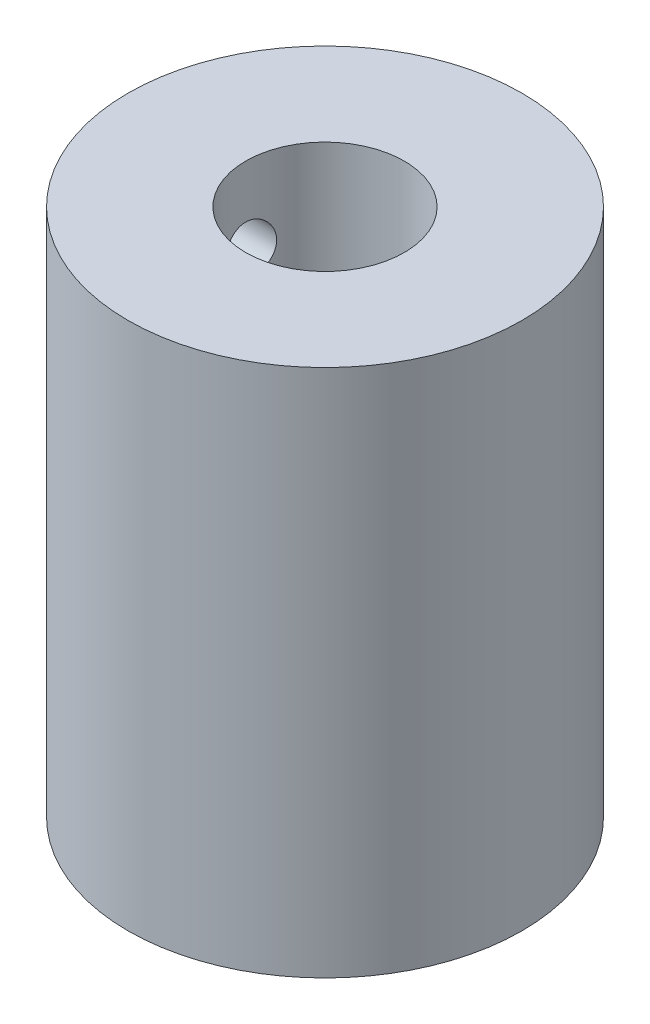
ISO-10303-21;
HEADER;
FILE_DESCRIPTION(('STEP AP214'),'2;1');
FILE_NAME('part.step','',(''),(''),'','','');
FILE_SCHEMA(('AUTOMOTIVE_DESIGN { 1 0 10303 214 1 1 1 1 }'));
ENDSEC;
DATA;
#1=APPLICATION_CONTEXT('core data for automotive mechanical design processes');
#2=APPLICATION_PROTOCOL_DEFINITION('international standard','automotive_design',2000,#1);
#3=PRODUCT_CONTEXT('',#1,'mechanical');
#4=PRODUCT('Part','Part','',(#3));
#5=PRODUCT_RELATED_PRODUCT_CATEGORY('part','',(#4));
#6=PRODUCT_DEFINITION_FORMATION('','',#4);
#7=PRODUCT_DEFINITION_CONTEXT('part definition',#1,'design');
#8=PRODUCT_DEFINITION('design','',#6,#7);
#9=PRODUCT_DEFINITION_SHAPE('','',#8);
#10=(LENGTH_UNIT() NAMED_UNIT(*) SI_UNIT(.MILLI.,.METRE.));
#11=(NAMED_UNIT(*) PLANE_ANGLE_UNIT() SI_UNIT($,.RADIAN.));
#12=(NAMED_UNIT(*) SI_UNIT($,.STERADIAN.) SOLID_ANGLE_UNIT());
#13=UNCERTAINTY_MEASURE_WITH_UNIT(LENGTH_MEASURE(1.E-05),#10,'distance_accuracy_value','');
#14=(GEOMETRIC_REPRESENTATION_CONTEXT(3) GLOBAL_UNCERTAINTY_ASSIGNED_CONTEXT((#13)) GLOBAL_UNIT_ASSIGNED_CONTEXT((#10,
#11,#12)) REPRESENTATION_CONTEXT('',''));
#15=CARTESIAN_POINT('',(0.,0.,0.));
#16=DIRECTION('',(0.,0.,1.));
#17=DIRECTION('',(1.,0.,0.));
#18=AXIS2_PLACEMENT_3D('',#15,#16,#17);
#19=CARTESIAN_POINT('',(0.,20.,0.));
#20=DIRECTION('',(0.,-1.,0.));
#21=DIRECTION('',(0.,0.,-1.));
#22=AXIS2_PLACEMENT_3D('',#19,#20,#21);
#23=CYLINDRICAL_SURFACE('',#22,7.45);
#24=CARTESIAN_POINT('',(1.,3.,-7.38258084954036));
#25=CARTESIAN_POINT('',(0.999997645400204,2.94410169763584,-7.38258170331428));
#26=CARTESIAN_POINT('',(0.99529724235351,2.88816932296943,-7.38322257330105));
#27=CARTESIAN_POINT('',(0.976622141665487,2.77786368377539,-7.38571557292466));
#28=CARTESIAN_POINT('',(0.962637977532072,2.72349206982755,-7.38756893889477));
#29=CARTESIAN_POINT('',(0.925817218650584,2.61792082504263,-7.39227331246216));
#30=CARTESIAN_POINT('',(0.902986905254793,2.56671897331643,-7.39512361203106));
#31=CARTESIAN_POINT('',(0.849135860641029,2.46888182869361,-7.40149984789184));
#32=CARTESIAN_POINT('',(0.818116434203476,2.42224580993907,-7.4050256765264));
#33=CARTESIAN_POINT('',(0.748554162377439,2.33455535543556,-7.41238108854343));
#34=CARTESIAN_POINT('',(0.70996908487496,2.29353455401465,-7.41621230187082));
#35=CARTESIAN_POINT('',(0.626461838407959,2.21852983336225,-7.42373218553235));
#36=CARTESIAN_POINT('',(0.581539343106109,2.18454627672732,-7.42742084851359));
#37=CARTESIAN_POINT('',(0.486419483847112,2.12445875346027,-7.43425684783715));
#38=CARTESIAN_POINT('',(0.436202597172797,2.0983854293843,-7.43740205922315));
#39=CARTESIAN_POINT('',(0.332053448363079,2.05505489150232,-7.44277880827385));
#40=CARTESIAN_POINT('',(0.278121344489348,2.03779730242485,-7.4450103848297));
#41=CARTESIAN_POINT('',(0.168417680763351,2.01268916471027,-7.44829693847962));
#42=CARTESIAN_POINT('',(0.112659170988225,2.00478252969571,-7.44935892800465));
#43=CARTESIAN_POINT('',(0.000597339815735183,1.99842680456468,-7.45021062828972));
#44=CARTESIAN_POINT('',(-0.0557059569452209,1.99997728875477,-7.45000039631629));
#45=CARTESIAN_POINT('',(-0.166877155876536,2.01244708134004,-7.4483369897478));
#46=CARTESIAN_POINT('',(-0.221751961335271,2.02330606355887,-7.44689181868991));
#47=CARTESIAN_POINT('',(-0.328893310994701,2.05399016724789,-7.44292986541744));
#48=CARTESIAN_POINT('',(-0.38115979927786,2.07381548084816,-7.44041306024));
#49=CARTESIAN_POINT('',(-0.481786167261498,2.12193279364412,-7.43457683220193));
#50=CARTESIAN_POINT('',(-0.530133534522473,2.15025065110632,-7.43125496408351));
#51=CARTESIAN_POINT('',(-0.621412782397326,2.21453037883939,-7.42417976807758));
#52=CARTESIAN_POINT('',(-0.66434437665651,2.250492653033,-7.42042641739582));
#53=CARTESIAN_POINT('',(-0.743928247923886,2.32937763276685,-7.41287289085389));
#54=CARTESIAN_POINT('',(-0.780528383536931,2.37235294845326,-7.40907257906374));
#55=CARTESIAN_POINT('',(-0.846004483868647,2.46386406866308,-7.40188251619775));
#56=CARTESIAN_POINT('',(-0.874880417194314,2.5123998957846,-7.39849276679056));
#57=CARTESIAN_POINT('',(-0.924092817199452,2.61370348413235,-7.39250771679622));
#58=CARTESIAN_POINT('',(-0.944424696491131,2.66647350067617,-7.38991284318795));
#59=CARTESIAN_POINT('',(-0.975923448856904,2.77472152376982,-7.38581938930108));
#60=CARTESIAN_POINT('',(-0.987090833972513,2.83019937884292,-7.38432074777396));
#61=CARTESIAN_POINT('',(-0.999873691203416,2.94182657431515,-7.3826007989611));
#62=CARTESIAN_POINT('',(-1.00156272811868,2.99796734453828,-7.38236965450527));
#63=CARTESIAN_POINT('',(-0.99553542929721,3.1097310753776,-7.38318482057278));
#64=CARTESIAN_POINT('',(-0.987819325611321,3.16535404873513,-7.38423109957856));
#65=CARTESIAN_POINT('',(-0.963262877705742,3.27428021059784,-7.3874742269472));
#66=CARTESIAN_POINT('',(-0.94645851261494,3.32759165711244,-7.38966653719971));
#67=CARTESIAN_POINT('',(-0.904239727209987,3.43064051388447,-7.39495101040206));
#68=CARTESIAN_POINT('',(-0.878824960954892,3.4803777804444,-7.39804320950612));
#69=CARTESIAN_POINT('',(-0.819927373465069,3.57519818581024,-7.40480247970032));
#70=CARTESIAN_POINT('',(-0.786396526269947,3.62025124876591,-7.40847292558871));
#71=CARTESIAN_POINT('',(-0.71228608981359,3.70411668208743,-7.4159646832325));
#72=CARTESIAN_POINT('',(-0.671706183397911,3.74292877150522,-7.41978600177005));
#73=CARTESIAN_POINT('',(-0.584327262843444,3.81347095708011,-7.42717934527045));
#74=CARTESIAN_POINT('',(-0.537488930586319,3.84515256841748,-7.43074955634675));
#75=CARTESIAN_POINT('',(-0.439112697014432,3.90019818744169,-7.43721093802309));
#76=CARTESIAN_POINT('',(-0.387574902646891,3.92356238435137,-7.44010212407058));
#77=CARTESIAN_POINT('',(-0.281420416728985,3.96123078553831,-7.44487168523601));
#78=CARTESIAN_POINT('',(-0.22681362410881,3.97556248128878,-7.44675313099575));
#79=CARTESIAN_POINT('',(-0.115941675997092,3.99484833990756,-7.44930402533317));
#80=CARTESIAN_POINT('',(-0.0596766074940375,3.99980299378309,-7.44997353737091));
#81=CARTESIAN_POINT('',(0.0524424419087253,4.00018397090241,-7.45002471277878));
#82=CARTESIAN_POINT('',(0.108296179416053,3.99568485092285,-7.44941645324873));
#83=CARTESIAN_POINT('',(0.218445784939562,3.97744456417632,-7.44700055517507));
#84=CARTESIAN_POINT('',(0.27274165526669,3.96370341111977,-7.44519291841072));
#85=CARTESIAN_POINT('',(0.378220726617245,3.92739361913248,-7.44058042312791));
#86=CARTESIAN_POINT('',(0.429405372349325,3.90482911410382,-7.43777603166324));
#87=CARTESIAN_POINT('',(0.527273569364535,3.85152090866849,-7.43147967949717));
#88=CARTESIAN_POINT('',(0.573957034252993,3.82077705131169,-7.42798770560238));
#89=CARTESIAN_POINT('',(0.661877738152335,3.75170906695792,-7.42067259000544));
#90=CARTESIAN_POINT('',(0.703071304334227,3.71332958550199,-7.41684715189412));
#91=CARTESIAN_POINT('',(0.77846166510691,3.63019565075688,-7.40931418752633));
#92=CARTESIAN_POINT('',(0.812656806728394,3.58543969562212,-7.40560668930051));
#93=CARTESIAN_POINT('',(0.873212613010541,3.49059207480214,-7.39871174636514));
#94=CARTESIAN_POINT('',(0.89953769411989,3.4404775254132,-7.39552669223205));
#95=CARTESIAN_POINT('',(0.943359794130172,3.33652238361955,-7.39006524262075));
#96=CARTESIAN_POINT('',(0.960866262074337,3.28268584994734,-7.38778787511548));
#97=CARTESIAN_POINT('',(0.982438375370373,3.19048578941782,-7.38494335708258));
#98=CARTESIAN_POINT('',(0.989014306737438,3.15269990570701,-7.38406192679017));
#99=CARTESIAN_POINT('',(0.997795905723238,3.07661468096957,-7.38288038311155));
#100=CARTESIAN_POINT('',(1.00000161395426,3.03831534471777,-7.38258026432326));
#101=CARTESIAN_POINT('',(1.,3.,-7.38258084954036));
#102=B_SPLINE_CURVE_WITH_KNOTS('',3,(#24,#25,#26,#27,#28,#29,#30,#31,#32,#33,#34,#35,#36,#37,
#38,#39,#40,#41,#42,#43,#44,#45,#46,#47,#48,#49,#50,#51,#52,#53,#54,#55,#56,#57,#58,#59,#60,#61,
#62,#63,#64,#65,#66,#67,#68,#69,#70,#71,#72,#73,#74,#75,#76,#77,#78,#79,#80,#81,#82,#83,#84,#85,
#86,#87,#88,#89,#90,#91,#92,#93,#94,#95,#96,#97,#98,#99,#100,#101),.UNSPECIFIED.,.T.,.F.,(4,2,2,
2,2,2,2,2,2,2,2,2,2,2,2,2,2,2,2,2,2,2,2,2,2,2,2,2,2,2,2,2,2,2,2,2,2,2,4),(0.,0.167554909925281,
0.335280935682564,0.50288808245323,0.670468540292591,0.839012539812198,1.00756522146231,
1.17676273978665,1.34595305504806,1.51412334720662,1.68228606956924,1.84936713787568,
2.01645178655633,2.18405043415548,2.35165793968893,2.52058606137221,2.68951486960931,
2.85853426188155,3.02754421000582,3.19524057881276,3.36293281016999,3.52996598021867,
3.69700586197165,3.86505944484783,4.03312059082576,4.20229211342098,4.37145978708404,
4.54011006057664,4.70875150284153,4.87606795524449,5.04338415943658,5.21062206666606,
5.37786318318436,5.54636405375193,5.71490467700144,5.88419619603604,6.05330593323288,
6.16815707400658,6.28300714746888),.UNSPECIFIED.);
#103=CARTESIAN_POINT('',(1.,3.,-7.38258084954036));
#104=VERTEX_POINT('',#103);
#105=EDGE_CURVE('E100',#104,#104,#102,.T.);
#106=ORIENTED_EDGE('',*,*,#105,.F.);
#107=EDGE_LOOP('',(#106));
#108=FACE_BOUND('',#107,.T.);
#109=CARTESIAN_POINT('',(-7.38258084954036,17.,-1.));
#110=CARTESIAN_POINT('',(-7.38258170331428,16.9441016976358,-0.999997645400203));
#111=CARTESIAN_POINT('',(-7.38322257330105,16.8881693229694,-0.995297242353509));
#112=CARTESIAN_POINT('',(-7.38571557292466,16.7778636837754,-0.976622141665486));
#113=CARTESIAN_POINT('',(-7.38756893889477,16.7234920698276,-0.962637977532071));
#114=CARTESIAN_POINT('',(-7.39227331246216,16.6179208250426,-0.925817218650584));
#115=CARTESIAN_POINT('',(-7.39512361203106,16.5667189733164,-0.902986905254794));
#116=CARTESIAN_POINT('',(-7.40149984789184,16.4688818286936,-0.849135860641032));
#117=CARTESIAN_POINT('',(-7.4050256765264,16.4222458099391,-0.818116434203478));
#118=CARTESIAN_POINT('',(-7.41238108854343,16.3345553554356,-0.748554162377441));
#119=CARTESIAN_POINT('',(-7.41621230187082,16.2935345540147,-0.709969084874962));
#120=CARTESIAN_POINT('',(-7.42373218553235,16.2185298333623,-0.62646183840796));
#121=CARTESIAN_POINT('',(-7.42742084851359,16.1845462767273,-0.581539343106111));
#122=CARTESIAN_POINT('',(-7.43425684783715,16.1244587534603,-0.486419483847114));
#123=CARTESIAN_POINT('',(-7.43740205922315,16.0983854293843,-0.436202597172799));
#124=CARTESIAN_POINT('',(-7.44277880827385,16.0550548915023,-0.33205344836308));
#125=CARTESIAN_POINT('',(-7.4450103848297,16.0377973024249,-0.278121344489349));
#126=CARTESIAN_POINT('',(-7.44829693847962,16.0126891647103,-0.168417680763352));
#127=CARTESIAN_POINT('',(-7.44935892800465,16.0047825296957,-0.112659170988225));
#128=CARTESIAN_POINT('',(-7.45021062828972,15.9984268045647,-0.000597339815735664));
#129=CARTESIAN_POINT('',(-7.45000039631629,15.9999772887548,0.0557059569452206));
#130=CARTESIAN_POINT('',(-7.4483369897478,16.01244708134,0.166877155876536));
#131=CARTESIAN_POINT('',(-7.44689181868991,16.0233060635589,0.22175196133527));
#132=CARTESIAN_POINT('',(-7.44292986541744,16.0539901672479,0.3288933109947));
#133=CARTESIAN_POINT('',(-7.44041306024,16.0738154808482,0.38115979927786));
#134=CARTESIAN_POINT('',(-7.43457683220193,16.1219327936441,0.481786167261498));
#135=CARTESIAN_POINT('',(-7.43125496408351,16.1502506511063,0.530133534522473));
#136=CARTESIAN_POINT('',(-7.42417976807758,16.2145303788394,0.621412782397326));
#137=CARTESIAN_POINT('',(-7.42042641739582,16.250492653033,0.664344376656511));
#138=CARTESIAN_POINT('',(-7.41287289085389,16.3293776327668,0.743928247923886));
#139=CARTESIAN_POINT('',(-7.40907257906374,16.3723529484533,0.780528383536931));
#140=CARTESIAN_POINT('',(-7.40188251619775,16.4638640686631,0.846004483868648));
#141=CARTESIAN_POINT('',(-7.39849276679055,16.5123998957846,0.874880417194316));
#142=CARTESIAN_POINT('',(-7.39250771679622,16.6137034841323,0.924092817199454));
#143=CARTESIAN_POINT('',(-7.38991284318795,16.6664735006762,0.944424696491133));
#144=CARTESIAN_POINT('',(-7.38581938930108,16.7747215237698,0.975923448856906));
#145=CARTESIAN_POINT('',(-7.38432074777396,16.8301993788429,0.987090833972515));
#146=CARTESIAN_POINT('',(-7.3826007989611,16.9418265743151,0.999873691203418));
#147=CARTESIAN_POINT('',(-7.38236965450527,16.9979673445383,1.00156272811868));
#148=CARTESIAN_POINT('',(-7.38318482057278,17.1097310753776,0.995535429297212));
#149=CARTESIAN_POINT('',(-7.38423109957856,17.1653540487351,0.987819325611323));
#150=CARTESIAN_POINT('',(-7.3874742269472,17.2742802105978,0.963262877705744));
#151=CARTESIAN_POINT('',(-7.38966653719971,17.3275916571124,0.946458512614942));
#152=CARTESIAN_POINT('',(-7.39495101040206,17.4306405138845,0.90423972720999));
#153=CARTESIAN_POINT('',(-7.39804320950611,17.4803777804444,0.878824960954896));
#154=CARTESIAN_POINT('',(-7.40480247970032,17.5751981858102,0.819927373465074));
#155=CARTESIAN_POINT('',(-7.40847292558871,17.6202512487659,0.786396526269952));
#156=CARTESIAN_POINT('',(-7.4159646832325,17.7041166820874,0.712286089813593));
#157=CARTESIAN_POINT('',(-7.41978600177005,17.7429287715052,0.671706183397914));
#158=CARTESIAN_POINT('',(-7.42717934527045,17.8134709570801,0.584327262843445));
#159=CARTESIAN_POINT('',(-7.43074955634675,17.8451525684175,0.537488930586321));
#160=CARTESIAN_POINT('',(-7.43721093802309,17.9001981874417,0.439112697014435));
#161=CARTESIAN_POINT('',(-7.44010212407058,17.9235623843514,0.387574902646894));
#162=CARTESIAN_POINT('',(-7.44487168523601,17.9612307855383,0.281420416728989));
#163=CARTESIAN_POINT('',(-7.44675313099575,17.9755624812888,0.226813624108814));
#164=CARTESIAN_POINT('',(-7.44930402533317,17.9948483399076,0.115941675997096));
#165=CARTESIAN_POINT('',(-7.44997353737091,17.9998029937831,0.0596766074940417));
#166=CARTESIAN_POINT('',(-7.45002471277878,18.0001839709024,-0.0524424419087207));
#167=CARTESIAN_POINT('',(-7.44941645324873,17.9956848509228,-0.108296179416048));
#168=CARTESIAN_POINT('',(-7.44700055517507,17.9774445641763,-0.218445784939557));
#169=CARTESIAN_POINT('',(-7.44519291841072,17.9637034111198,-0.272741655266686));
#170=CARTESIAN_POINT('',(-7.44058042312791,17.9273936191325,-0.378220726617241));
#171=CARTESIAN_POINT('',(-7.43777603166324,17.9048291141038,-0.429405372349321));
#172=CARTESIAN_POINT('',(-7.43147967949717,17.8515209086685,-0.527273569364532));
#173=CARTESIAN_POINT('',(-7.42798770560238,17.8207770513117,-0.573957034252989));
#174=CARTESIAN_POINT('',(-7.42067259000544,17.7517090669579,-0.661877738152331));
#175=CARTESIAN_POINT('',(-7.41684715189412,17.713329585502,-0.703071304334223));
#176=CARTESIAN_POINT('',(-7.40931418752633,17.6301956507569,-0.778461665106906));
#177=CARTESIAN_POINT('',(-7.40560668930052,17.5854396956221,-0.812656806728391));
#178=CARTESIAN_POINT('',(-7.39871174636514,17.4905920748021,-0.873212613010539));
#179=CARTESIAN_POINT('',(-7.39552669223205,17.4404775254132,-0.899537694119888));
#180=CARTESIAN_POINT('',(-7.39006524262075,17.3365223836196,-0.94335979413017));
#181=CARTESIAN_POINT('',(-7.38778787511548,17.2826858499473,-0.960866262074336));
#182=CARTESIAN_POINT('',(-7.38494335708258,17.1904857894178,-0.982438375370372));
#183=CARTESIAN_POINT('',(-7.38406192679017,17.152699905707,-0.989014306737437));
#184=CARTESIAN_POINT('',(-7.38288038311155,17.0766146809696,-0.997795905723237));
#185=CARTESIAN_POINT('',(-7.38258026432326,17.0383153447178,-1.00000161395426));
#186=CARTESIAN_POINT('',(-7.38258084954036,17.,-1.));
#187=B_SPLINE_CURVE_WITH_KNOTS('',3,(#109,#110,#111,#112,#113,#114,#115,#116,#117,#118,#119,
#120,#121,#122,#123,#124,#125,#126,#127,#128,#129,#130,#131,#132,#133,#134,#135,#136,#137,#138,
#139,#140,#141,#142,#143,#144,#145,#146,#147,#148,#149,#150,#151,#152,#153,#154,#155,#156,#157,
#158,#159,#160,#161,#162,#163,#164,#165,#166,#167,#168,#169,#170,#171,#172,#173,#174,#175,#176,
#177,#178,#179,#180,#181,#182,#183,#184,#185,#186),.UNSPECIFIED.,.T.,.F.,(4,2,2,2,2,2,2,2,2,2,2,
2,2,2,2,2,2,2,2,2,2,2,2,2,2,2,2,2,2,2,2,2,2,2,2,2,2,2,4),(0.,0.167554909925278,
0.335280935682562,0.502888082453225,0.670468540292588,0.839012539812195,1.00756522146231,
1.17676273978665,1.34595305504806,1.51412334720662,1.68228606956924,1.84936713787568,
2.01645178655633,2.18405043415547,2.35165793968893,2.52058606137221,2.68951486960931,
2.85853426188155,3.02754421000582,3.19524057881276,3.36293281016999,3.52996598021868,
3.69700586197165,3.86505944484783,4.03312059082576,4.20229211342098,4.37145978708404,
4.54011006057664,4.70875150284153,4.87606795524449,5.04338415943658,5.21062206666606,
5.37786318318437,5.54636405375193,5.71490467700144,5.88419619603604,6.05330593323288,
6.16815707400659,6.28300714746889),.UNSPECIFIED.);
#188=CARTESIAN_POINT('',(-7.38258084954036,17.,-1.));
#189=VERTEX_POINT('',#188);
#190=EDGE_CURVE('E76',#189,#189,#187,.T.);
#191=ORIENTED_EDGE('',*,*,#190,.F.);
#192=EDGE_LOOP('',(#191));
#193=FACE_BOUND('',#192,.T.);
#194=CARTESIAN_POINT('',(0.,20.,0.));
#195=DIRECTION('',(0.,1.,0.));
#196=DIRECTION('',(0.,0.,1.));
#197=AXIS2_PLACEMENT_3D('',#194,#195,#196);
#198=CIRCLE('',#197,7.45);
#199=CARTESIAN_POINT('',(0.,20.,7.45));
#200=VERTEX_POINT('',#199);
#201=EDGE_CURVE('E10',#200,#200,#198,.T.);
#202=ORIENTED_EDGE('',*,*,#201,.F.);
#203=EDGE_LOOP('',(#202));
#204=FACE_BOUND('',#203,.T.);
#205=CARTESIAN_POINT('',(0.,0.,0.));
#206=DIRECTION('',(0.,1.,0.));
#207=DIRECTION('',(0.,0.,1.));
#208=AXIS2_PLACEMENT_3D('',#205,#206,#207);
#209=CIRCLE('',#208,7.45);
#210=CARTESIAN_POINT('',(0.,0.,7.45));
#211=VERTEX_POINT('',#210);
#212=EDGE_CURVE('E56',#211,#211,#209,.T.);
#213=ORIENTED_EDGE('',*,*,#212,.T.);
#214=EDGE_LOOP('',(#213));
#215=FACE_BOUND('',#214,.T.);
#216=ADVANCED_FACE('F43',(#108,#193,#204,#215),#23,.T.);
#217=CARTESIAN_POINT('',(0.,20.,0.));
#218=DIRECTION('',(0.,1.,0.));
#219=DIRECTION('',(0.,0.,1.));
#220=AXIS2_PLACEMENT_3D('',#217,#218,#219);
#221=PLANE('',#220);
#222=CARTESIAN_POINT('',(0.,20.,0.));
#223=DIRECTION('',(0.,1.,0.));
#224=DIRECTION('',(0.,0.,1.));
#225=AXIS2_PLACEMENT_3D('',#222,#223,#224);
#226=CIRCLE('',#225,3.);
#227=CARTESIAN_POINT('',(0.,20.,3.));
#228=VERTEX_POINT('',#227);
#229=EDGE_CURVE('E65',#228,#228,#226,.T.);
#230=ORIENTED_EDGE('',*,*,#229,.F.);
#231=EDGE_LOOP('',(#230));
#232=FACE_BOUND('',#231,.T.);
#233=ORIENTED_EDGE('',*,*,#201,.T.);
#234=EDGE_LOOP('',(#233));
#235=FACE_BOUND('',#234,.T.);
#236=ADVANCED_FACE('F119',(#232,#235),#221,.T.);
#237=CARTESIAN_POINT('',(0.,0.,0.));
#238=DIRECTION('',(0.,1.,0.));
#239=DIRECTION('',(0.,0.,1.));
#240=AXIS2_PLACEMENT_3D('',#237,#238,#239);
#241=PLANE('',#240);
#242=CARTESIAN_POINT('',(0.,0.,0.));
#243=DIRECTION('',(0.,-1.,0.));
#244=DIRECTION('',(0.,0.,-1.));
#245=AXIS2_PLACEMENT_3D('',#242,#243,#244);
#246=CIRCLE('',#245,2.5);
#247=CARTESIAN_POINT('',(0.,0.,-2.5));
#248=VERTEX_POINT('',#247);
#249=EDGE_CURVE('E75',#248,#248,#246,.T.);
#250=ORIENTED_EDGE('',*,*,#249,.F.);
#251=EDGE_LOOP('',(#250));
#252=FACE_BOUND('',#251,.T.);
#253=ORIENTED_EDGE('',*,*,#212,.F.);
#254=EDGE_LOOP('',(#253));
#255=FACE_BOUND('',#254,.T.);
#256=ADVANCED_FACE('F121',(#252,#255),#241,.F.);
#257=CARTESIAN_POINT('',(0.,6.,0.));
#258=DIRECTION('',(0.,1.,0.));
#259=DIRECTION('',(0.,0.,1.));
#260=AXIS2_PLACEMENT_3D('',#257,#258,#259);
#261=CYLINDRICAL_SURFACE('',#260,3.);
#262=CARTESIAN_POINT('',(-2.82842712474619,17.,-1.));
#263=CARTESIAN_POINT('',(-2.82842694532735,16.9455318251893,-1.0000002579478));
#264=CARTESIAN_POINT('',(-2.83001769372806,16.8910652002285,-0.995534783698141));
#265=CARTESIAN_POINT('',(-2.8361757417458,16.7837455790494,-0.977851131702565));
#266=CARTESIAN_POINT('',(-2.8407435316722,16.7308928501361,-0.964631512170674));
#267=CARTESIAN_POINT('',(-2.85228203663888,16.6283731069872,-0.929955485680263));
#268=CARTESIAN_POINT('',(-2.8592480396464,16.5787000705531,-0.908515221402));
#269=CARTESIAN_POINT('',(-2.87479122017008,16.4836399514562,-0.858061628442626));
#270=CARTESIAN_POINT('',(-2.88336875305432,16.4382538174475,-0.829046628860522));
#271=CARTESIAN_POINT('',(-2.90154489405589,16.3512800376605,-0.763051146442526));
#272=CARTESIAN_POINT('',(-2.91116894844139,16.309884571328,-0.725824341377824));
#273=CARTESIAN_POINT('',(-2.93013864801509,16.2337931987757,-0.644987667214489));
#274=CARTESIAN_POINT('',(-2.93948424829099,16.1990983684177,-0.601376775052401));
#275=CARTESIAN_POINT('',(-2.95713866921658,16.1365211026703,-0.507604507964984));
#276=CARTESIAN_POINT('',(-2.96541407701568,16.108840029382,-0.457301911224518));
#277=CARTESIAN_POINT('',(-2.97969586771021,16.0624084148725,-0.35243122298748));
#278=CARTESIAN_POINT('',(-2.98570286203012,16.0436554668231,-0.297864285687213));
#279=CARTESIAN_POINT('',(-2.99459075431897,16.0162641453676,-0.188028817433491));
#280=CARTESIAN_POINT('',(-2.99757314777558,16.007296553743,-0.132850754852966));
#281=CARTESIAN_POINT('',(-3.00043608218249,15.9986837066393,-0.0216978748240898));
#282=CARTESIAN_POINT('',(-3.00031742262891,15.9990360483476,0.034276733543894));
#283=CARTESIAN_POINT('',(-2.99706039618736,16.008844254566,0.143103515193819));
#284=CARTESIAN_POINT('',(-2.99404064755135,16.0179425284745,0.195992048591669));
#285=CARTESIAN_POINT('',(-2.98546967339714,16.0443929809805,0.299443438822162));
#286=CARTESIAN_POINT('',(-2.97991827631115,16.0617457189798,0.350006137779177));
#287=CARTESIAN_POINT('',(-2.96675670293292,16.1044213173061,0.448152474842015));
#288=CARTESIAN_POINT('',(-2.9591204252427,16.1298459385468,0.495688220968999));
#289=CARTESIAN_POINT('',(-2.94258393038665,16.1878597054484,0.585924325527171));
#290=CARTESIAN_POINT('',(-2.93368336200518,16.2204508433266,0.628623334384771));
#291=CARTESIAN_POINT('',(-2.9150619185089,16.2936743934607,0.710100866551908));
#292=CARTESIAN_POINT('',(-2.90532215172667,16.3346131578454,0.748600157067557));
#293=CARTESIAN_POINT('',(-2.88647335245111,16.4224487257227,0.81827725959589));
#294=CARTESIAN_POINT('',(-2.8773644173145,16.4693464457132,0.849453943273005));
#295=CARTESIAN_POINT('',(-2.86070525135531,16.5686536256154,0.903987455042733));
#296=CARTESIAN_POINT('',(-2.85317909338821,16.6211321313678,0.92722646365105));
#297=CARTESIAN_POINT('',(-2.84081650878299,16.7295713942663,0.964443193299508));
#298=CARTESIAN_POINT('',(-2.83597895501223,16.7855306812218,0.97842479575553));
#299=CARTESIAN_POINT('',(-2.8297963630207,16.8966383554006,0.996161282090474));
#300=CARTESIAN_POINT('',(-2.82830360315139,16.9517094247457,1.00034909550575));
#301=CARTESIAN_POINT('',(-2.828566720628,17.061776149117,0.999605438911604));
#302=CARTESIAN_POINT('',(-2.83032200792768,17.1167718160248,0.99467562522726));
#303=CARTESIAN_POINT('',(-2.83673618089379,17.2231569657112,0.976225651551829));
#304=CARTESIAN_POINT('',(-2.84129325440593,17.2746054301506,0.963006393980554));
#305=CARTESIAN_POINT('',(-2.8526855367127,17.3745436062394,0.928713862560595));
#306=CARTESIAN_POINT('',(-2.85952114934907,17.4230327915908,0.907639196363456));
#307=CARTESIAN_POINT('',(-2.87496877595718,17.5173804208469,0.857474340738899));
#308=CARTESIAN_POINT('',(-2.8836302566561,17.5631066426418,0.828151118358485));
#309=CARTESIAN_POINT('',(-2.90165768730984,17.6491460523837,0.762585630557566));
#310=CARTESIAN_POINT('',(-2.911023844438,17.6894576386612,0.726341325498783));
#311=CARTESIAN_POINT('',(-2.92995038637844,17.7655279840906,0.645891705900321));
#312=CARTESIAN_POINT('',(-2.93949843577895,17.8009743900189,0.601387270546649));
#313=CARTESIAN_POINT('',(-2.9572685161311,17.863916142348,0.506827291400255));
#314=CARTESIAN_POINT('',(-2.96549059417695,17.8914117711624,0.45677194486455));
#315=CARTESIAN_POINT('',(-2.97964405810603,17.9374201048617,0.352779862432294));
#316=CARTESIAN_POINT('',(-2.98559030004531,17.9559912771481,0.298871123321195));
#317=CARTESIAN_POINT('',(-2.99458610837774,17.9837277420601,0.188458465846016));
#318=CARTESIAN_POINT('',(-2.99763672034018,17.9928964298805,0.131955491953888));
#319=CARTESIAN_POINT('',(-3.00041863236257,18.0012620776056,0.020815335860039));
#320=CARTESIAN_POINT('',(-3.00029920089441,18.0009074539324,-0.0337847239200205));
#321=CARTESIAN_POINT('',(-2.99712196519396,17.9913426918536,-0.142111145000175));
#322=CARTESIAN_POINT('',(-2.99406439933567,17.9821332718472,-0.195837576819057));
#323=CARTESIAN_POINT('',(-2.98540914954421,17.955417765424,-0.300042119432062));
#324=CARTESIAN_POINT('',(-2.9798525836118,17.9380457846471,-0.350558270912796));
#325=CARTESIAN_POINT('',(-2.96677160704464,17.8956224689029,-0.44797835093979));
#326=CARTESIAN_POINT('',(-2.95924684047901,17.8705697448031,-0.494881624142411));
#327=CARTESIAN_POINT('',(-2.94265868828001,17.8124304878979,-0.58563401630881));
#328=CARTESIAN_POINT('',(-2.93354872492381,17.7790813146181,-0.629306251557699));
#329=CARTESIAN_POINT('',(-2.91492988791425,17.7057426088441,-0.710581026272341));
#330=CARTESIAN_POINT('',(-2.90542088771397,17.6657509577383,-0.748181621624261));
#331=CARTESIAN_POINT('',(-2.88663279827365,17.578390644412,-0.817741808833465));
#332=CARTESIAN_POINT('',(-2.87737727995345,17.5307944890192,-0.849422965999217));
#333=CARTESIAN_POINT('',(-2.86060193316303,17.4306655731014,-0.904314343299799));
#334=CARTESIAN_POINT('',(-2.8530816513617,17.3781341069858,-0.927526776814559));
#335=CARTESIAN_POINT('',(-2.84101334230535,17.2720381759762,-0.963843828206627));
#336=CARTESIAN_POINT('',(-2.83634632944799,17.2186277364343,-0.977357909163268));
#337=CARTESIAN_POINT('',(-2.83005383613939,17.1101439494845,-0.995434320161695));
#338=CARTESIAN_POINT('',(-2.82842730615135,17.0550711825643,-0.999999739196503));
#339=CARTESIAN_POINT('',(-2.82842712474619,17.,-1.));
#340=B_SPLINE_CURVE_WITH_KNOTS('',3,(#262,#263,#264,#265,#266,#267,#268,#269,#270,#271,#272,
#273,#274,#275,#276,#277,#278,#279,#280,#281,#282,#283,#284,#285,#286,#287,#288,#289,#290,#291,
#292,#293,#294,#295,#296,#297,#298,#299,#300,#301,#302,#303,#304,#305,#306,#307,#308,#309,#310,
#311,#312,#313,#314,#315,#316,#317,#318,#319,#320,#321,#322,#323,#324,#325,#326,#327,#328,#329,
#330,#331,#332,#333,#334,#335,#336,#337,#338,#339),.UNSPECIFIED.,.T.,.F.,(4,2,2,2,2,2,2,2,2,2,2,
2,2,2,2,2,2,2,2,2,2,2,2,2,2,2,2,2,2,2,2,2,2,2,2,2,2,2,4),(0.,0.163200584775416,
0.326428054968882,0.489336627454547,0.652281166139164,0.8210133742294,0.989772651673598,
1.16293506139029,1.33605076382161,1.50314318760306,1.67019253297699,1.83069004820941,
1.99119844184609,2.15381654855707,2.31647991869394,2.4868017435929,2.65714979607478,
2.82992639837376,3.00263051349689,3.16754291357513,3.33242535830307,3.49164395761849,
3.65089079140019,3.81518857728788,3.97953485655201,4.15178808164166,4.32403518750606,
4.49513791183925,4.6661788299723,4.82918084670709,4.99216964002854,5.15256956033503,
5.31299850756316,5.47935519513707,5.64576504425705,5.81868902729218,5.99156778259939,
6.15663212153686,6.3216394717923),.UNSPECIFIED.);
#341=CARTESIAN_POINT('',(-2.82842712474619,17.,-1.));
#342=VERTEX_POINT('',#341);
#343=EDGE_CURVE('E67',#342,#342,#340,.T.);
#344=ORIENTED_EDGE('',*,*,#343,.T.);
#345=EDGE_LOOP('',(#344));
#346=FACE_BOUND('',#345,.T.);
#347=CARTESIAN_POINT('',(0.,6.,0.));
#348=DIRECTION('',(0.,1.,0.));
#349=DIRECTION('',(0.,0.,1.));
#350=AXIS2_PLACEMENT_3D('',#347,#348,#349);
#351=CIRCLE('',#350,3.);
#352=CARTESIAN_POINT('',(0.,6.,3.));
#353=VERTEX_POINT('',#352);
#354=EDGE_CURVE('E62',#353,#353,#351,.T.);
#355=ORIENTED_EDGE('',*,*,#354,.F.);
#356=EDGE_LOOP('',(#355));
#357=FACE_BOUND('',#356,.T.);
#358=ORIENTED_EDGE('',*,*,#229,.T.);
#359=EDGE_LOOP('',(#358));
#360=FACE_BOUND('',#359,.T.);
#361=ADVANCED_FACE('F77',(#346,#357,#360),#261,.F.);
#362=CARTESIAN_POINT('',(0.,6.,0.));
#363=DIRECTION('',(0.,1.,0.));
#364=DIRECTION('',(0.,0.,1.));
#365=AXIS2_PLACEMENT_3D('',#362,#363,#364);
#366=PLANE('',#365);
#367=CARTESIAN_POINT('',(0.,6.,0.));
#368=DIRECTION('',(0.,-1.,0.));
#369=DIRECTION('',(0.,0.,-1.));
#370=AXIS2_PLACEMENT_3D('',#367,#368,#369);
#371=CIRCLE('',#370,2.5);
#372=CARTESIAN_POINT('',(0.,6.,-2.5));
#373=VERTEX_POINT('',#372);
#374=EDGE_CURVE('E104',#373,#373,#371,.T.);
#375=ORIENTED_EDGE('',*,*,#374,.T.);
#376=EDGE_LOOP('',(#375));
#377=FACE_BOUND('',#376,.T.);
#378=ORIENTED_EDGE('',*,*,#354,.T.);
#379=EDGE_LOOP('',(#378));
#380=FACE_BOUND('',#379,.T.);
#381=ADVANCED_FACE('F144',(#377,#380),#366,.T.);
#382=CARTESIAN_POINT('',(0.,6.,0.));
#383=DIRECTION('',(0.,-1.,0.));
#384=DIRECTION('',(0.,0.,-1.));
#385=AXIS2_PLACEMENT_3D('',#382,#383,#384);
#386=CYLINDRICAL_SURFACE('',#385,2.5);
#387=CARTESIAN_POINT('',(0.,4.,-2.5));
#388=CARTESIAN_POINT('',(0.0537465027214457,3.99999507408813,-2.49999635613542));
#389=CARTESIAN_POINT('',(0.107586282045337,3.99564112395581,-2.49824647153466));
#390=CARTESIAN_POINT('',(0.213748240208948,3.97837614823938,-2.49141726550321));
#391=CARTESIAN_POINT('',(0.266065888780624,3.96544186045693,-2.48632889349439));
#392=CARTESIAN_POINT('',(0.367476961363701,3.93156196097058,-2.47337104606559));
#393=CARTESIAN_POINT('',(0.416580330808479,3.91064257689164,-2.46551068182036));
#394=CARTESIAN_POINT('',(0.510535985164184,3.86149041333673,-2.44778305398039));
#395=CARTESIAN_POINT('',(0.555389738375496,3.83326017254053,-2.43791648729028));
#396=CARTESIAN_POINT('',(0.641750503785197,3.76888225071953,-2.41665443085209));
#397=CARTESIAN_POINT('',(0.683031136275107,3.73244667187987,-2.40521148464595));
#398=CARTESIAN_POINT('',(0.759087502392362,3.65329999826161,-2.38230288453097));
#399=CARTESIAN_POINT('',(0.793860053566767,3.61058585139413,-2.37083722226896));
#400=CARTESIAN_POINT('',(0.85743728364644,3.51778596487887,-2.34861395898568));
#401=CARTESIAN_POINT('',(0.885907490597738,3.4674567569884,-2.33791057982476));
#402=CARTESIAN_POINT('',(0.933877359518575,3.36223180078998,-2.31916823593396));
#403=CARTESIAN_POINT('',(0.953381282142919,3.30733823607582,-2.31112800622088));
#404=CARTESIAN_POINT('',(0.981949411697935,3.19714383320395,-2.29913178830409));
#405=CARTESIAN_POINT('',(0.991446982902826,3.14197438221189,-2.29500710177802));
#406=CARTESIAN_POINT('',(1.00108648082002,3.03068250084637,-2.29082002024572));
#407=CARTESIAN_POINT('',(1.00123300815661,2.97456055268749,-2.29075562761384));
#408=CARTESIAN_POINT('',(0.992494683752274,2.86712166427098,-2.29455250139997));
#409=CARTESIAN_POINT('',(0.984237657152571,2.81574214279549,-2.29814087519225));
#410=CARTESIAN_POINT('',(0.959973440148912,2.71517022199664,-2.30838093803918));
#411=CARTESIAN_POINT('',(0.943964897402318,2.66597820594485,-2.31503316160836));
#412=CARTESIAN_POINT('',(0.904347366275539,2.56999108190198,-2.33079742544265));
#413=CARTESIAN_POINT('',(0.880589931157662,2.52326538047266,-2.33995689640394));
#414=CARTESIAN_POINT('',(0.82625323036611,2.43429209181922,-2.35969058194945));
#415=CARTESIAN_POINT('',(0.795671402550425,2.3920461952986,-2.37026532728424));
#416=CARTESIAN_POINT('',(0.72577529972722,2.309795135599,-2.39263368371135));
#417=CARTESIAN_POINT('',(0.685968731485321,2.27021563527699,-2.40445832488076));
#418=CARTESIAN_POINT('',(0.6001572137151,2.19815776099898,-2.42729912479141));
#419=CARTESIAN_POINT('',(0.554151032667221,2.16568080129485,-2.43831512222662));
#420=CARTESIAN_POINT('',(0.456038826302925,2.10819127629208,-2.45857340632274));
#421=CARTESIAN_POINT('',(0.403830245673242,2.08333885940147,-2.46777635047707));
#422=CARTESIAN_POINT('',(0.295511882741445,2.04291606946097,-2.48307414164379));
#423=CARTESIAN_POINT('',(0.239404098424841,2.0273409812213,-2.48917056731191));
#424=CARTESIAN_POINT('',(0.128447943803914,2.00677585229015,-2.49728069753455));
#425=CARTESIAN_POINT('',(0.0737216469927711,2.00121377287322,-2.49951472916757));
#426=CARTESIAN_POINT('',(-0.0359226549039048,1.99914344973569,-2.50034239255315));
#427=CARTESIAN_POINT('',(-0.090840606611958,2.00263285922624,-2.49893696791146));
#428=CARTESIAN_POINT('',(-0.19671636956099,2.01814587627599,-2.49278783531877));
#429=CARTESIAN_POINT('',(-0.247741245887734,2.02977899017549,-2.48819695672762));
#430=CARTESIAN_POINT('',(-0.347067714030386,2.06071785415491,-2.4762972070275));
#431=CARTESIAN_POINT('',(-0.395368955112418,2.08002458983434,-2.46898798678265));
#432=CARTESIAN_POINT('',(-0.489539392908347,2.12639246983997,-2.45208297385406));
#433=CARTESIAN_POINT('',(-0.535289011377699,2.15367273602157,-2.44242407989902));
#434=CARTESIAN_POINT('',(-0.621721795623274,2.21497016195282,-2.42186682372762));
#435=CARTESIAN_POINT('',(-0.662402920380559,2.24899002146131,-2.41096796555135));
#436=CARTESIAN_POINT('',(-0.740361521514406,2.32543500647481,-2.38822558819056));
#437=CARTESIAN_POINT('',(-0.777236966903029,2.3682667707531,-2.37636720712526));
#438=CARTESIAN_POINT('',(-0.843375598706852,2.45972004150468,-2.35370836458566));
#439=CARTESIAN_POINT('',(-0.872637530668751,2.50834250016997,-2.34290807763256));
#440=CARTESIAN_POINT('',(-0.922903750965811,2.61073084729705,-2.32357149953854));
#441=CARTESIAN_POINT('',(-0.943825297267224,2.66454199960615,-2.31505815442394));
#442=CARTESIAN_POINT('',(-0.976148109852649,2.77536682585757,-2.30161836738966));
#443=CARTESIAN_POINT('',(-0.987556402634655,2.83237810290621,-2.29668927847999));
#444=CARTESIAN_POINT('',(-0.999857808639198,2.94356395088727,-2.29135879649963));
#445=CARTESIAN_POINT('',(-1.00144854115143,2.99764741979667,-2.29065710504086));
#446=CARTESIAN_POINT('',(-0.99590157963876,3.10527242885664,-2.29307418016549));
#447=CARTESIAN_POINT('',(-0.988764993956889,3.15881403695129,-2.29619246162397));
#448=CARTESIAN_POINT('',(-0.966535683076822,3.26166609492752,-2.3056332453951));
#449=CARTESIAN_POINT('',(-0.951768746785487,3.3110601372165,-2.31182415913725));
#450=CARTESIAN_POINT('',(-0.915002724245505,3.40668931480674,-2.32662000616348));
#451=CARTESIAN_POINT('',(-0.893001640696905,3.45292357344991,-2.33522560603003));
#452=CARTESIAN_POINT('',(-0.840936381379864,3.54380480963539,-2.35449304802246));
#453=CARTESIAN_POINT('',(-0.810482667579744,3.58820933506524,-2.36524441156621));
#454=CARTESIAN_POINT('',(-0.742946059635747,3.67149665860188,-2.38731902186119));
#455=CARTESIAN_POINT('',(-0.70586116740906,3.71037778606416,-2.39864244024203));
#456=CARTESIAN_POINT('',(-0.62325275313623,3.78410142663181,-2.42146783543697));
#457=CARTESIAN_POINT('',(-0.577338000573068,3.81851865344903,-2.43293378981093));
#458=CARTESIAN_POINT('',(-0.479950160142888,3.87916852131082,-2.45400203356858));
#459=CARTESIAN_POINT('',(-0.428474502273617,3.90539735607626,-2.46360345546453));
#460=CARTESIAN_POINT('',(-0.3223690312476,3.94831110759514,-2.47969857407931));
#461=CARTESIAN_POINT('',(-0.267815809109846,3.96516466178017,-2.48624681527514));
#462=CARTESIAN_POINT('',(-0.156438273140609,3.98931956047713,-2.49572153104683));
#463=CARTESIAN_POINT('',(-0.099621762929455,3.99665121837195,-2.49865949747819));
#464=CARTESIAN_POINT('',(-0.028456148945464,3.99969769048914,-2.49987949752068));
#465=CARTESIAN_POINT('',(-0.0142313443703788,4.0000013043146,-2.50000096484588));
#466=CARTESIAN_POINT('',(0.,4.,-2.5));
#467=B_SPLINE_CURVE_WITH_KNOTS('',3,(#387,#388,#389,#390,#391,#392,#393,#394,#395,#396,#397,
#398,#399,#400,#401,#402,#403,#404,#405,#406,#407,#408,#409,#410,#411,#412,#413,#414,#415,#416,
#417,#418,#419,#420,#421,#422,#423,#424,#425,#426,#427,#428,#429,#430,#431,#432,#433,#434,#435,
#436,#437,#438,#439,#440,#441,#442,#443,#444,#445,#446,#447,#448,#449,#450,#451,#452,#453,#454,
#455,#456,#457,#458,#459,#460,#461,#462,#463,#464,#465,#466),.UNSPECIFIED.,.T.,.F.,(4,2,2,2,2,2,
2,2,2,2,2,2,2,2,2,2,2,2,2,2,2,2,2,2,2,2,2,2,2,2,2,2,2,2,2,2,2,2,2,4),(0.,0.161201493946536,
0.322841818003967,0.48395572873579,0.645013767839921,0.812986908501986,0.981041974672057,
1.15657629409608,1.33202711559134,1.49952052654414,1.66693153170244,1.82269164200686,
1.97847893628024,2.13744563149408,2.29647210969092,2.46779174593278,2.63914546419866,
2.81388456581403,2.98853478056895,3.15284592264004,3.31711446785041,3.47400227782183,
3.63091024496898,3.79261756699131,3.95438979749484,4.12684237312207,4.29932334521874,
4.47347522570414,4.64749836322967,4.80899836696374,4.97047786281523,5.12557159274384,
5.28070817902581,5.44472734028346,5.60879600674197,5.78350211766918,5.95828931820266,
6.12982150506659,6.30080626202171,6.34349022948398),.UNSPECIFIED.);
#468=CARTESIAN_POINT('',(0.,4.,-2.5));
#469=VERTEX_POINT('',#468);
#470=EDGE_CURVE('E46',#469,#469,#467,.T.);
#471=ORIENTED_EDGE('',*,*,#470,.T.);
#472=EDGE_LOOP('',(#471));
#473=FACE_BOUND('',#472,.T.);
#474=ORIENTED_EDGE('',*,*,#374,.F.);
#475=EDGE_LOOP('',(#474));
#476=FACE_BOUND('',#475,.T.);
#477=ORIENTED_EDGE('',*,*,#249,.T.);
#478=EDGE_LOOP('',(#477));
#479=FACE_BOUND('',#478,.T.);
#480=ADVANCED_FACE('F87',(#473,#476,#479),#386,.F.);
#481=CARTESIAN_POINT('',(-7.451,17.,0.));
#482=DIRECTION('',(1.,0.,0.));
#483=DIRECTION('',(0.,0.,-1.));
#484=AXIS2_PLACEMENT_3D('',#481,#482,#483);
#485=CYLINDRICAL_SURFACE('',#484,1.);
#486=ORIENTED_EDGE('',*,*,#190,.T.);
#487=EDGE_LOOP('',(#486));
#488=FACE_BOUND('',#487,.T.);
#489=ORIENTED_EDGE('',*,*,#343,.F.);
#490=EDGE_LOOP('',(#489));
#491=FACE_BOUND('',#490,.T.);
#492=ADVANCED_FACE('F81',(#488,#491),#485,.F.);
#493=CARTESIAN_POINT('',(0.,3.,-7.451));
#494=DIRECTION('',(0.,0.,1.));
#495=DIRECTION('',(1.,0.,0.));
#496=AXIS2_PLACEMENT_3D('',#493,#494,#495);
#497=CYLINDRICAL_SURFACE('',#496,1.);
#498=ORIENTED_EDGE('',*,*,#105,.T.);
#499=EDGE_LOOP('',(#498));
#500=FACE_BOUND('',#499,.T.);
#501=ORIENTED_EDGE('',*,*,#470,.F.);
#502=EDGE_LOOP('',(#501));
#503=FACE_BOUND('',#502,.T.);
#504=ADVANCED_FACE('F86',(#500,#503),#497,.F.);
#505=CLOSED_SHELL('',(#216,#236,#256,#361,#381,#480,#492,#504));
#506=MANIFOLD_SOLID_BREP('B2',#505);
#507=ADVANCED_BREP_SHAPE_REPRESENTATION('',(#18,#506),#14);
#508=SHAPE_DEFINITION_REPRESENTATION(#9,#507);
ENDSEC;
END-ISO-10303-21;
